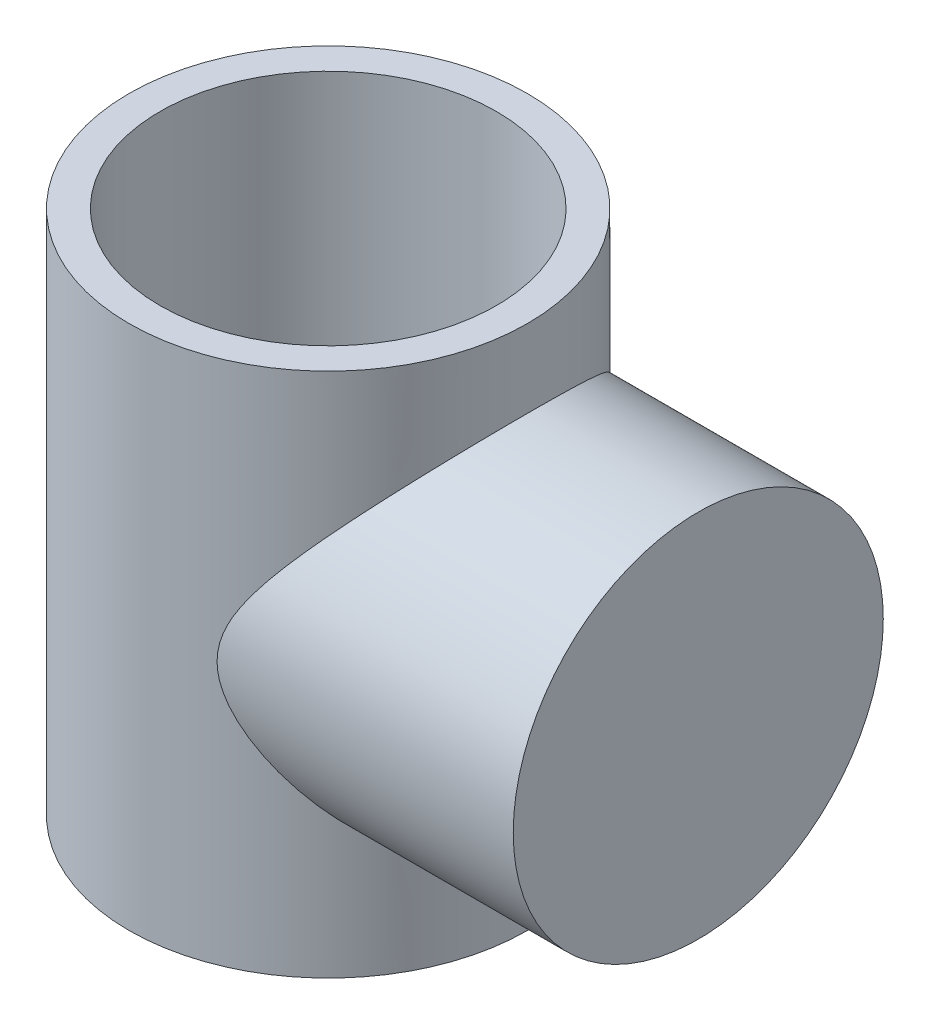
ISO-10303-21;
HEADER;
FILE_DESCRIPTION(('STEP AP214'),'2;1');
FILE_NAME('part.step','',(''),(''),'','','');
FILE_SCHEMA(('AUTOMOTIVE_DESIGN { 1 0 10303 214 1 1 1 1 }'));
ENDSEC;
DATA;
#1=APPLICATION_CONTEXT('core data for automotive mechanical design processes');
#2=APPLICATION_PROTOCOL_DEFINITION('international standard','automotive_design',2000,#1);
#3=PRODUCT_CONTEXT('',#1,'mechanical');
#4=PRODUCT('Part','Part','',(#3));
#5=PRODUCT_RELATED_PRODUCT_CATEGORY('part','',(#4));
#6=PRODUCT_DEFINITION_FORMATION('','',#4);
#7=PRODUCT_DEFINITION_CONTEXT('part definition',#1,'design');
#8=PRODUCT_DEFINITION('design','',#6,#7);
#9=PRODUCT_DEFINITION_SHAPE('','',#8);
#10=(LENGTH_UNIT() NAMED_UNIT(*) SI_UNIT(.MILLI.,.METRE.));
#11=(NAMED_UNIT(*) PLANE_ANGLE_UNIT() SI_UNIT($,.RADIAN.));
#12=(NAMED_UNIT(*) SI_UNIT($,.STERADIAN.) SOLID_ANGLE_UNIT());
#13=UNCERTAINTY_MEASURE_WITH_UNIT(LENGTH_MEASURE(1.E-05),#10,'distance_accuracy_value','');
#14=(GEOMETRIC_REPRESENTATION_CONTEXT(3) GLOBAL_UNCERTAINTY_ASSIGNED_CONTEXT((#13)) GLOBAL_UNIT_ASSIGNED_CONTEXT((#10,
#11,#12)) REPRESENTATION_CONTEXT('',''));
#15=CARTESIAN_POINT('',(0.,0.,0.));
#16=DIRECTION('',(0.,0.,1.));
#17=DIRECTION('',(1.,0.,0.));
#18=AXIS2_PLACEMENT_3D('',#15,#16,#17);
#19=CARTESIAN_POINT('',(8.8,0.,0.));
#20=DIRECTION('',(-1.,0.,0.));
#21=DIRECTION('',(0.,0.,1.));
#22=AXIS2_PLACEMENT_3D('',#19,#20,#21);
#23=CYLINDRICAL_SURFACE('',#22,4.4);
#24=CARTESIAN_POINT('',(8.8,0.,0.));
#25=DIRECTION('',(1.,0.,0.));
#26=DIRECTION('',(0.,0.,-1.));
#27=AXIS2_PLACEMENT_3D('',#24,#25,#26);
#28=CIRCLE('',#27,4.4);
#29=CARTESIAN_POINT('',(8.8,0.,-4.4));
#30=VERTEX_POINT('',#29);
#31=EDGE_CURVE('E49',#30,#30,#28,.T.);
#32=ORIENTED_EDGE('',*,*,#31,.F.);
#33=EDGE_LOOP('',(#32));
#34=FACE_BOUND('',#33,.T.);
#35=CARTESIAN_POINT('',(1.75672927443752,0.,4.4));
#36=CARTESIAN_POINT('',(1.75674987996824,0.119288297072757,4.39999522993259));
#37=CARTESIAN_POINT('',(1.76922445806631,0.238600354285825,4.39507136579842));
#38=CARTESIAN_POINT('',(1.81548032072919,0.472539478344693,4.37614757599676));
#39=CARTESIAN_POINT('',(1.84937140003263,0.587139142396223,4.36210087042096));
#40=CARTESIAN_POINT('',(1.92194286579823,0.783623282877571,4.33052164025592));
#41=CARTESIAN_POINT('',(1.95768120712352,0.866922707689579,4.31455717768415));
#42=CARTESIAN_POINT('',(2.0350840233242,1.02985961677391,4.27859223450159));
#43=CARTESIAN_POINT('',(2.0767529932371,1.10949426223184,4.25858868766349));
#44=CARTESIAN_POINT('',(2.16421001085839,1.26566389383535,4.21481817146252));
#45=CARTESIAN_POINT('',(2.21000932761895,1.34218951970468,4.19104076277856));
#46=CARTESIAN_POINT('',(2.30430585457653,1.4923564000232,4.13994653945406));
#47=CARTESIAN_POINT('',(2.35280399274187,1.56599664734046,4.1126285030519));
#48=CARTESIAN_POINT('',(2.49597528270529,1.77595289112981,4.02840029392129));
#49=CARTESIAN_POINT('',(2.5928841288687,1.9089633429716,3.96700306081224));
#50=CARTESIAN_POINT('',(2.78857314263953,2.16727159399137,3.83199102189156));
#51=CARTESIAN_POINT('',(2.88735465853313,2.2925635370414,3.75836709230964));
#52=CARTESIAN_POINT('',(3.0839040722395,2.53563901504733,3.59883755176534));
#53=CARTESIAN_POINT('',(3.18167306512272,2.65343157493166,3.51294712255372));
#54=CARTESIAN_POINT('',(3.37407476366544,2.88131671633893,3.32858496934278));
#55=CARTESIAN_POINT('',(3.46870921497694,2.99141362290148,3.2301204015585));
#56=CARTESIAN_POINT('',(3.69723629980968,3.25414763567116,2.96972674414832));
#57=CARTESIAN_POINT('',(3.82816513921558,3.40183288259418,2.80002329526905));
#58=CARTESIAN_POINT('',(4.07200841604617,3.67406645291776,2.43176884696852));
#59=CARTESIAN_POINT('',(4.18495430574808,3.79865523631949,2.23326940073929));
#60=CARTESIAN_POINT('',(4.36469854671309,3.99571854942133,1.85209360985781));
#61=CARTESIAN_POINT('',(4.43621057405159,4.07364076576223,1.6745224315855));
#62=CARTESIAN_POINT('',(4.52811940131056,4.17347974034127,1.39705577353695));
#63=CARTESIAN_POINT('',(4.55620164060325,4.20392494058935,1.30268665966015));
#64=CARTESIAN_POINT('',(4.60675584585702,4.25866325234495,1.11073437489072));
#65=CARTESIAN_POINT('',(4.62923029123984,4.2829590827943,1.01315264609827));
#66=CARTESIAN_POINT('',(4.66827193959215,4.32512762442211,0.814644894838515));
#67=CARTESIAN_POINT('',(4.68479317391597,4.34295036061788,0.713699159061955));
#68=CARTESIAN_POINT('',(4.71131913393753,4.37155108966724,0.510010151921079));
#69=CARTESIAN_POINT('',(4.72132691858511,4.38233238944055,0.407267747650924));
#70=CARTESIAN_POINT('',(4.73460096138303,4.39663002619451,0.200859632533936));
#71=CARTESIAN_POINT('',(4.73786831496498,4.4001475436601,0.0971940744655504));
#72=CARTESIAN_POINT('',(4.73758545527755,4.39984297777433,-0.110110065108143));
#73=CARTESIAN_POINT('',(4.73403585404646,4.39602155332618,-0.213748648199795));
#74=CARTESIAN_POINT('',(4.7209858157351,4.38196477179024,-0.408418312144811));
#75=CARTESIAN_POINT('',(4.71220076443027,4.37250041618936,-0.499554484639848));
#76=CARTESIAN_POINT('',(4.6895011947576,4.34802759272778,-0.680441809569555));
#77=CARTESIAN_POINT('',(4.67558508722017,4.33301740723254,-0.770192523923847));
#78=CARTESIAN_POINT('',(4.62648671026986,4.28000752588692,-1.03643235960101));
#79=CARTESIAN_POINT('',(4.58394296760469,4.23401627825545,-1.21007082173841));
#80=CARTESIAN_POINT('',(4.47999602253203,4.1212574936105,-1.55207500117399));
#81=CARTESIAN_POINT('',(4.41794867615669,4.05377912439773,-1.72000260676986));
#82=CARTESIAN_POINT('',(4.27899801841252,3.90187866293206,-2.04131487675192));
#83=CARTESIAN_POINT('',(4.20208774367941,3.81744862800481,-2.19469267405928));
#84=CARTESIAN_POINT('',(3.99320920603394,3.58653489702294,-2.56231743584982));
#85=CARTESIAN_POINT('',(3.85349893794404,3.43070788605734,-2.76638249903369));
#86=CARTESIAN_POINT('',(3.63137612189387,3.17842169810538,-3.04523514910208));
#87=CARTESIAN_POINT('',(3.55508928000664,3.09105625138682,-3.13378378524749));
#88=CARTESIAN_POINT('',(3.39941624826092,2.91067317968293,-3.30199463255871));
#89=CARTESIAN_POINT('',(3.32003057225947,2.8176564903905,-3.38165830867298));
#90=CARTESIAN_POINT('',(3.1573101567067,2.62399343830312,-3.53415372866225));
#91=CARTESIAN_POINT('',(3.07392631523852,2.52321380063931,-3.6067624361655));
#92=CARTESIAN_POINT('',(2.90647834139488,2.31629535594032,-3.74300974617242));
#93=CARTESIAN_POINT('',(2.82241419882525,2.21015646847267,-3.80664821399491));
#94=CARTESIAN_POINT('',(2.65545138102354,1.99253556166889,-3.92493504782636));
#95=CARTESIAN_POINT('',(2.57255058688373,1.88106553324392,-3.97960246724745));
#96=CARTESIAN_POINT('',(2.4100748481848,1.65194524996979,-4.08003988170114));
#97=CARTESIAN_POINT('',(2.33049745413462,1.53429969643343,-4.12581652383058));
#98=CARTESIAN_POINT('',(2.18842844326984,1.30761152980075,-4.20267862282195));
#99=CARTESIAN_POINT('',(2.12507234777351,1.19950734148629,-4.23490843951764));
#100=CARTESIAN_POINT('',(2.00757287232747,0.976352380359331,-4.29185146529054));
#101=CARTESIAN_POINT('',(1.95342630319861,0.861304031024935,-4.31656727874617));
#102=CARTESIAN_POINT('',(1.86897003495998,0.644256763225787,-4.35371220216558));
#103=CARTESIAN_POINT('',(1.8361442640281,0.54351361784858,-4.36753669615721));
#104=CARTESIAN_POINT('',(1.78612708785808,0.337655721974604,-4.38823517335018));
#105=CARTESIAN_POINT('',(1.7688828876029,0.232557005313993,-4.395132636325));
#106=CARTESIAN_POINT('',(1.75362017113112,0.0197058698096356,-4.40125091944095));
#107=CARTESIAN_POINT('',(1.75577238551961,-0.0880617713685559,-4.40040356745377));
#108=CARTESIAN_POINT('',(1.77918740234311,-0.301232675431295,-4.39098142734383));
#109=CARTESIAN_POINT('',(1.8004946433336,-0.406629855873515,-4.3823886702048));
#110=CARTESIAN_POINT('',(1.86819570442561,-0.649906661878078,-4.35404043530084));
#111=CARTESIAN_POINT('',(1.92090895288697,-0.785593913604552,-4.3313545731529));
#112=CARTESIAN_POINT('',(2.04204564523456,-1.04760521314885,-4.27558343753585));
#113=CARTESIAN_POINT('',(2.11053571653884,-1.17388645703223,-4.24245383379115));
#114=CARTESIAN_POINT('',(2.25951715985795,-1.42476516252157,-4.16510516786618));
#115=CARTESIAN_POINT('',(2.34044136515714,-1.54895144488949,-4.12040838629285));
#116=CARTESIAN_POINT('',(2.50677627436376,-1.79037899868113,-4.0213894610489));
#117=CARTESIAN_POINT('',(2.59219114344399,-1.90761359998033,-3.96705826639249));
#118=CARTESIAN_POINT('',(2.76471317672119,-2.13615108904333,-3.84882089957838));
#119=CARTESIAN_POINT('',(2.85182267748177,-2.24744485785957,-3.78490055072231));
#120=CARTESIAN_POINT('',(3.02560877163717,-2.46422251956186,-3.64747393732432));
#121=CARTESIAN_POINT('',(3.11228550730964,-2.56970845434274,-3.57397107277106));
#122=CARTESIAN_POINT('',(3.29105499996142,-2.78364576538913,-3.41042016385364));
#123=CARTESIAN_POINT('',(3.38297397419746,-2.89157439584891,-3.31949348088662));
#124=CARTESIAN_POINT('',(3.56276442082665,-3.09999391860651,-3.12574578039507));
#125=CARTESIAN_POINT('',(3.65063462141249,-3.20048247975258,-3.02292106057697));
#126=CARTESIAN_POINT('',(3.82023299307679,-3.39265577071723,-2.80550311554674));
#127=CARTESIAN_POINT('',(3.90198125381205,-3.48436959788697,-2.69095159279873));
#128=CARTESIAN_POINT('',(4.05773303820391,-3.65794519765265,-2.44980120724925));
#129=CARTESIAN_POINT('',(4.13173854195809,-3.73980948993118,-2.32320544047834));
#130=CARTESIAN_POINT('',(4.28709574092174,-3.91084037872023,-2.02523603106032));
#131=CARTESIAN_POINT('',(4.36574446402257,-3.99681337290604,-1.85052724233655));
#132=CARTESIAN_POINT('',(4.46889974452446,-4.10915833572378,-1.57626581561978));
#133=CARTESIAN_POINT('',(4.50082076485927,-4.14384355266255,-1.48278970217821));
#134=CARTESIAN_POINT('',(4.55919889663263,-4.20717825851137,-1.29217601380355));
#135=CARTESIAN_POINT('',(4.58565863039564,-4.23583064431577,-1.1950402227439));
#136=CARTESIAN_POINT('',(4.63280962396084,-4.28683126287915,-0.996816253090601));
#137=CARTESIAN_POINT('',(4.65344949019351,-4.30912334893162,-0.895701331365177));
#138=CARTESIAN_POINT('',(4.68820082482236,-4.34662847475279,-0.691106903024323));
#139=CARTESIAN_POINT('',(4.70231555098488,-4.36184504709165,-0.587628603497898));
#140=CARTESIAN_POINT('',(4.72369524543598,-4.38488511659123,-0.379176164074022));
#141=CARTESIAN_POINT('',(4.73096213732908,-4.39271068993665,-0.274202452664173));
#142=CARTESIAN_POINT('',(4.7384728846494,-4.40079877220635,-0.0637196382463433));
#143=CARTESIAN_POINT('',(4.73871749275005,-4.40106209167997,0.0417894061702606));
#144=CARTESIAN_POINT('',(4.73256419170637,-4.39443595096063,0.239933757174514));
#145=CARTESIAN_POINT('',(4.72694470693861,-4.38838471295093,0.332622675800307));
#146=CARTESIAN_POINT('',(4.71035297958057,-4.37050771981782,0.516967437902934));
#147=CARTESIAN_POINT('',(4.69937905468673,-4.35868014983617,0.608622947428686));
#148=CARTESIAN_POINT('',(4.65870181744129,-4.31480375241497,0.881015386263907));
#149=CARTESIAN_POINT('',(4.6212371884065,-4.27435499194734,1.05935039106963));
#150=CARTESIAN_POINT('',(4.52767283878634,-4.17302115339734,1.40678853660607));
#151=CARTESIAN_POINT('',(4.47139276513418,-4.11193822760803,1.5757831329739));
#152=CARTESIAN_POINT('',(4.34349454485285,-3.97248180849051,1.90015597917241));
#153=CARTESIAN_POINT('',(4.27187207521456,-3.89410344165803,2.0555303738299));
#154=CARTESIAN_POINT('',(4.07804874097367,-3.68066621899575,2.4244189757298));
#155=CARTESIAN_POINT('',(3.94830842369969,-3.53670125703453,2.6288898534073));
#156=CARTESIAN_POINT('',(3.74040576179704,-3.30239642342712,2.91018817756673));
#157=CARTESIAN_POINT('',(3.66872285517171,-3.22104260020848,2.99988307669093));
#158=CARTESIAN_POINT('',(3.52194178012054,-3.05281322533965,3.17091371895901));
#159=CARTESIAN_POINT('',(3.44684454027291,-2.96593917247182,3.25225171550023));
#160=CARTESIAN_POINT('',(3.27507727035663,-2.76467916085057,3.42613923401267));
#161=CARTESIAN_POINT('',(3.17773041482019,-2.64886760031218,3.51636609688872));
#162=CARTESIAN_POINT('',(2.9813228144067,-2.40974344819279,3.68435985821151));
#163=CARTESIAN_POINT('',(2.88226090446072,-2.28642560192402,3.76211788632755));
#164=CARTESIAN_POINT('',(2.68522244252335,-2.03242607116747,3.90518413257127));
#165=CARTESIAN_POINT('',(2.58724411295632,-1.90175964308262,3.97051699405741));
#166=CARTESIAN_POINT('',(2.39585512550662,-1.63191928965651,4.08883243031699));
#167=CARTESIAN_POINT('',(2.30243879909807,-1.49275643202106,4.14183065684413));
#168=CARTESIAN_POINT('',(2.14579693945016,-1.23544175252762,4.22465367004346));
#169=CARTESIAN_POINT('',(2.08045436437363,-1.11941616727165,4.257011445915));
#170=CARTESIAN_POINT('',(1.96175021996346,-0.879340180603874,4.31299282391472));
#171=CARTESIAN_POINT('',(1.90836556807135,-0.755305845683112,4.33663331119654));
#172=CARTESIAN_POINT('',(1.83147800968017,-0.526400962421874,4.36957381308067));
#173=CARTESIAN_POINT('',(1.8040045503475,-0.423212752212139,4.3808725300688));
#174=CARTESIAN_POINT('',(1.76665336282597,-0.213346469379926,4.39607413893954));
#175=CARTESIAN_POINT('',(1.75671084635648,-0.106682736615509,4.40000426599975));
#176=CARTESIAN_POINT('',(1.75672927443752,0.,4.4));
#177=B_SPLINE_CURVE_WITH_KNOTS('',3,(#35,#36,#37,#38,#39,#40,#41,#42,#43,#44,#45,#46,#47,#48,
#49,#50,#51,#52,#53,#54,#55,#56,#57,#58,#59,#60,#61,#62,#63,#64,#65,#66,#67,#68,#69,#70,#71,#72,
#73,#74,#75,#76,#77,#78,#79,#80,#81,#82,#83,#84,#85,#86,#87,#88,#89,#90,#91,#92,#93,#94,#95,#96,
#97,#98,#99,#100,#101,#102,#103,#104,#105,#106,#107,#108,#109,#110,#111,#112,#113,#114,#115,
#116,#117,#118,#119,#120,#121,#122,#123,#124,#125,#126,#127,#128,#129,#130,#131,#132,#133,#134,
#135,#136,#137,#138,#139,#140,#141,#142,#143,#144,#145,#146,#147,#148,#149,#150,#151,#152,#153,
#154,#155,#156,#157,#158,#159,#160,#161,#162,#163,#164,#165,#166,#167,#168,#169,#170,#171,#172,
#173,#174,#175,#176),.UNSPECIFIED.,.T.,.F.,(4,2,2,2,2,2,2,2,2,2,2,2,2,2,2,2,2,2,2,2,2,2,2,2,2,2,
2,2,2,2,2,2,2,2,2,2,2,2,2,2,2,2,2,2,2,2,2,2,2,2,2,2,2,2,2,2,2,2,2,2,2,2,2,2,2,2,2,2,2,2,4),(0.,
0.357332881324894,0.716512709602758,0.992244308324182,1.26818601804555,1.54490479084755,
1.8217193062788,2.34792459797537,2.87452433215642,3.40047787417625,3.92613340761929,
4.70414377652462,5.48077808783957,6.09811990941575,6.40696752743076,6.71567834907686,
7.02672427958723,7.33762402614954,7.64847324237543,7.95929455131243,8.23510277920491,
8.51099650113729,9.06230236118334,9.63416759989775,10.2063014130411,11.0780240292082,
11.5155088371654,11.952921405842,12.4013681432936,12.8498216131078,13.2973099375124,
13.7444624030828,14.1321123937771,14.5196278701142,14.8390999371483,15.1574854334862,
15.4786761326741,15.800613904138,16.2401091049237,16.6814955248721,17.1452969738979,
17.6095364690229,18.0744691903008,18.5392373947044,19.0439020874565,19.5487242403824,
20.0518097234079,20.5547662335234,21.1819956844463,21.4957528402888,21.8093589882997,
22.1256534675568,22.4417898614264,22.7578374238769,23.0738511110959,23.3526705284792,
23.6315776041841,24.1888812605415,24.7516878210121,25.3146531719193,26.1548205585803,
26.5767020123694,26.9984694077036,27.5262764541371,28.0544573325519,28.5815794659702,
29.1080290278345,29.5184873393651,29.928146375102,30.2489067174477,30.568479136519),.UNSPECIFIED.);
#178=CARTESIAN_POINT('',(1.75672927443752,0.,4.4));
#179=VERTEX_POINT('',#178);
#180=EDGE_CURVE('E10',#179,#179,#177,.T.);
#181=ORIENTED_EDGE('',*,*,#180,.F.);
#182=EDGE_LOOP('',(#181));
#183=FACE_BOUND('',#182,.T.);
#184=ADVANCED_FACE('F39',(#34,#183),#23,.T.);
#185=CARTESIAN_POINT('',(8.8,0.,0.));
#186=DIRECTION('',(1.,0.,0.));
#187=DIRECTION('',(0.,0.,-1.));
#188=AXIS2_PLACEMENT_3D('',#185,#186,#187);
#189=PLANE('',#188);
#190=ORIENTED_EDGE('',*,*,#31,.T.);
#191=EDGE_LOOP('',(#190));
#192=FACE_BOUND('',#191,.T.);
#193=ADVANCED_FACE('F86',(#192),#189,.T.);
#194=CARTESIAN_POINT('',(0.,6.25,0.));
#195=DIRECTION('',(0.,-1.,0.));
#196=DIRECTION('',(0.,0.,-1.));
#197=AXIS2_PLACEMENT_3D('',#194,#195,#196);
#198=CYLINDRICAL_SURFACE('',#197,4.73773128656172);
#199=CARTESIAN_POINT('',(0.,-6.25,0.));
#200=DIRECTION('',(0.,1.,0.));
#201=DIRECTION('',(0.,0.,1.));
#202=AXIS2_PLACEMENT_3D('',#199,#200,#201);
#203=CIRCLE('',#202,4.73773128656172);
#204=CARTESIAN_POINT('',(0.,-6.25,4.73773128656172));
#205=VERTEX_POINT('',#204);
#206=EDGE_CURVE('E59',#205,#205,#203,.T.);
#207=ORIENTED_EDGE('',*,*,#206,.T.);
#208=EDGE_LOOP('',(#207));
#209=FACE_BOUND('',#208,.T.);
#210=CARTESIAN_POINT('',(0.,6.25,0.));
#211=DIRECTION('',(0.,1.,0.));
#212=DIRECTION('',(0.,0.,1.));
#213=AXIS2_PLACEMENT_3D('',#210,#211,#212);
#214=CIRCLE('',#213,4.73773128656172);
#215=CARTESIAN_POINT('',(0.,6.25,4.73773128656172));
#216=VERTEX_POINT('',#215);
#217=EDGE_CURVE('E53',#216,#216,#214,.T.);
#218=ORIENTED_EDGE('',*,*,#217,.F.);
#219=EDGE_LOOP('',(#218));
#220=FACE_BOUND('',#219,.T.);
#221=ORIENTED_EDGE('',*,*,#180,.T.);
#222=EDGE_LOOP('',(#221));
#223=FACE_BOUND('',#222,.T.);
#224=ADVANCED_FACE('F83',(#209,#220,#223),#198,.T.);
#225=CARTESIAN_POINT('',(0.,6.25,0.));
#226=DIRECTION('',(0.,-1.,0.));
#227=DIRECTION('',(0.,0.,-1.));
#228=AXIS2_PLACEMENT_3D('',#225,#226,#227);
#229=CYLINDRICAL_SURFACE('',#228,4.);
#230=CARTESIAN_POINT('',(0.,-6.25,0.));
#231=DIRECTION('',(0.,1.,0.));
#232=DIRECTION('',(0.,0.,1.));
#233=AXIS2_PLACEMENT_3D('',#230,#231,#232);
#234=CIRCLE('',#233,4.);
#235=CARTESIAN_POINT('',(0.,-6.25,4.));
#236=VERTEX_POINT('',#235);
#237=EDGE_CURVE('E64',#236,#236,#234,.T.);
#238=ORIENTED_EDGE('',*,*,#237,.F.);
#239=EDGE_LOOP('',(#238));
#240=FACE_BOUND('',#239,.T.);
#241=CARTESIAN_POINT('',(0.,6.25,0.));
#242=DIRECTION('',(0.,1.,0.));
#243=DIRECTION('',(0.,0.,1.));
#244=AXIS2_PLACEMENT_3D('',#241,#242,#243);
#245=CIRCLE('',#244,4.);
#246=CARTESIAN_POINT('',(0.,6.25,4.));
#247=VERTEX_POINT('',#246);
#248=EDGE_CURVE('E65',#247,#247,#245,.T.);
#249=ORIENTED_EDGE('',*,*,#248,.T.);
#250=EDGE_LOOP('',(#249));
#251=FACE_BOUND('',#250,.T.);
#252=ADVANCED_FACE('F67',(#240,#251),#229,.F.);
#253=CARTESIAN_POINT('',(0.,6.25,0.));
#254=DIRECTION('',(0.,1.,0.));
#255=DIRECTION('',(0.,0.,1.));
#256=AXIS2_PLACEMENT_3D('',#253,#254,#255);
#257=PLANE('',#256);
#258=ORIENTED_EDGE('',*,*,#217,.T.);
#259=EDGE_LOOP('',(#258));
#260=FACE_BOUND('',#259,.T.);
#261=ORIENTED_EDGE('',*,*,#248,.F.);
#262=EDGE_LOOP('',(#261));
#263=FACE_BOUND('',#262,.T.);
#264=ADVANCED_FACE('F75',(#260,#263),#257,.T.);
#265=CARTESIAN_POINT('',(0.,-6.25,0.));
#266=DIRECTION('',(0.,1.,0.));
#267=DIRECTION('',(0.,0.,1.));
#268=AXIS2_PLACEMENT_3D('',#265,#266,#267);
#269=PLANE('',#268);
#270=ORIENTED_EDGE('',*,*,#206,.F.);
#271=EDGE_LOOP('',(#270));
#272=FACE_BOUND('',#271,.T.);
#273=ORIENTED_EDGE('',*,*,#237,.T.);
#274=EDGE_LOOP('',(#273));
#275=FACE_BOUND('',#274,.T.);
#276=ADVANCED_FACE('F74',(#272,#275),#269,.F.);
#277=CLOSED_SHELL('',(#184,#193,#224,#252,#264,#276));
#278=MANIFOLD_SOLID_BREP('B2',#277);
#279=ADVANCED_BREP_SHAPE_REPRESENTATION('',(#18,#278),#14);
#280=SHAPE_DEFINITION_REPRESENTATION(#9,#279);
ENDSEC;
END-ISO-10303-21;
